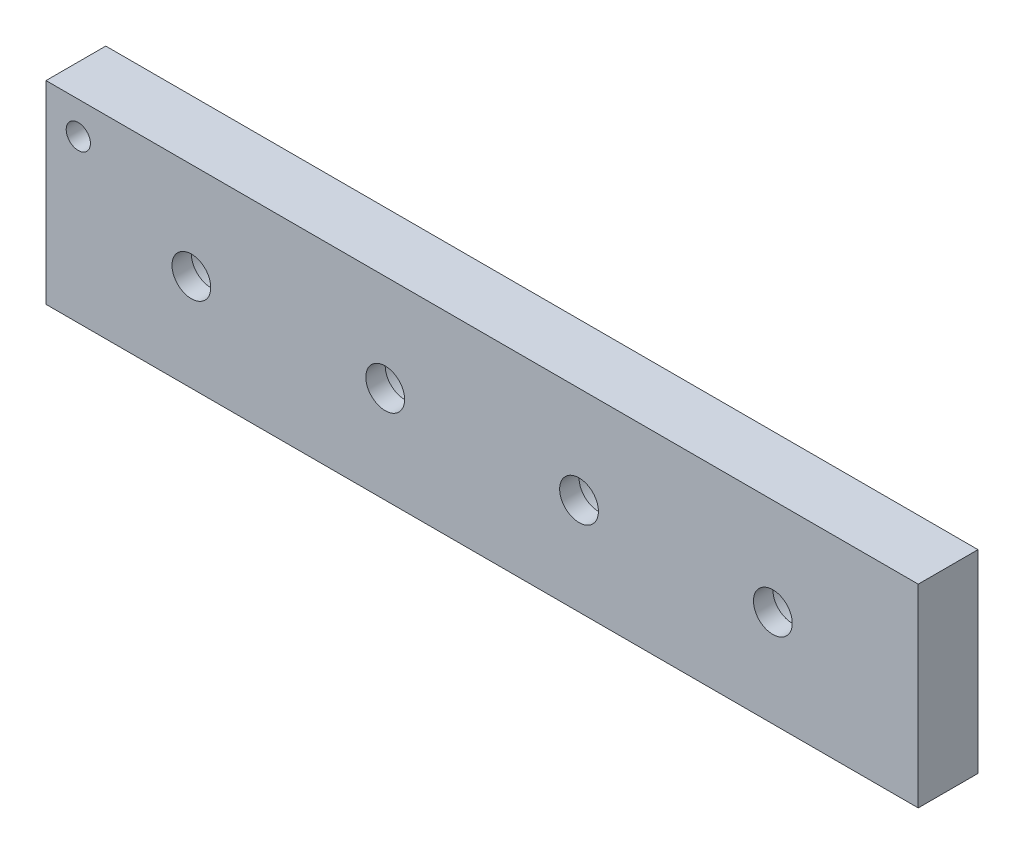
ISO-10303-21;
HEADER;
FILE_DESCRIPTION(('STEP AP214'),'2;1');
FILE_NAME('part.step','',(''),(''),'','','');
FILE_SCHEMA(('AUTOMOTIVE_DESIGN { 1 0 10303 214 1 1 1 1 }'));
ENDSEC;
DATA;
#1=APPLICATION_CONTEXT('core data for automotive mechanical design processes');
#2=APPLICATION_PROTOCOL_DEFINITION('international standard','automotive_design',2000,#1);
#3=PRODUCT_CONTEXT('',#1,'mechanical');
#4=PRODUCT('Part','Part','',(#3));
#5=PRODUCT_RELATED_PRODUCT_CATEGORY('part','',(#4));
#6=PRODUCT_DEFINITION_FORMATION('','',#4);
#7=PRODUCT_DEFINITION_CONTEXT('part definition',#1,'design');
#8=PRODUCT_DEFINITION('design','',#6,#7);
#9=PRODUCT_DEFINITION_SHAPE('','',#8);
#10=(LENGTH_UNIT() NAMED_UNIT(*) SI_UNIT(.MILLI.,.METRE.));
#11=(NAMED_UNIT(*) PLANE_ANGLE_UNIT() SI_UNIT($,.RADIAN.));
#12=(NAMED_UNIT(*) SI_UNIT($,.STERADIAN.) SOLID_ANGLE_UNIT());
#13=UNCERTAINTY_MEASURE_WITH_UNIT(LENGTH_MEASURE(1.E-05),#10,'distance_accuracy_value','');
#14=(GEOMETRIC_REPRESENTATION_CONTEXT(3) GLOBAL_UNCERTAINTY_ASSIGNED_CONTEXT((#13)) GLOBAL_UNIT_ASSIGNED_CONTEXT((#10,
#11,#12)) REPRESENTATION_CONTEXT('',''));
#15=CARTESIAN_POINT('',(0.,0.,0.));
#16=DIRECTION('',(0.,0.,1.));
#17=DIRECTION('',(1.,0.,0.));
#18=AXIS2_PLACEMENT_3D('',#15,#16,#17);
#19=CARTESIAN_POINT('',(-27.,-6.,3.7));
#20=DIRECTION('',(1.,0.,0.));
#21=DIRECTION('',(0.,0.,-1.));
#22=AXIS2_PLACEMENT_3D('',#19,#20,#21);
#23=PLANE('',#22);
#24=DIRECTION('',(0.,-1.,0.));
#25=VECTOR('',#24,1.);
#26=CARTESIAN_POINT('',(-27.,-6.,0.));
#27=LINE('',#26,#25);
#28=CARTESIAN_POINT('',(-27.,6.,0.));
#29=VERTEX_POINT('',#28);
#30=CARTESIAN_POINT('',(-27.,-6.,0.));
#31=VERTEX_POINT('',#30);
#32=EDGE_CURVE('E117',#29,#31,#27,.T.);
#33=ORIENTED_EDGE('',*,*,#32,.T.);
#34=DIRECTION('',(0.,0.,-1.));
#35=VECTOR('',#34,1.);
#36=CARTESIAN_POINT('',(-27.,-6.,3.7));
#37=LINE('',#36,#35);
#38=CARTESIAN_POINT('',(-27.,-6.,3.7));
#39=VERTEX_POINT('',#38);
#40=EDGE_CURVE('E11',#39,#31,#37,.T.);
#41=ORIENTED_EDGE('',*,*,#40,.F.);
#42=DIRECTION('',(0.,-1.,0.));
#43=VECTOR('',#42,1.);
#44=CARTESIAN_POINT('',(-27.,-6.,3.7));
#45=LINE('',#44,#43);
#46=CARTESIAN_POINT('',(-27.,6.,3.7));
#47=VERTEX_POINT('',#46);
#48=EDGE_CURVE('E97',#47,#39,#45,.T.);
#49=ORIENTED_EDGE('',*,*,#48,.F.);
#50=DIRECTION('',(0.,0.,-1.));
#51=VECTOR('',#50,1.);
#52=CARTESIAN_POINT('',(-27.,6.,3.7));
#53=LINE('',#52,#51);
#54=EDGE_CURVE('E115',#47,#29,#53,.T.);
#55=ORIENTED_EDGE('',*,*,#54,.T.);
#56=EDGE_LOOP('',(#33,#41,#49,#55));
#57=FACE_BOUND('',#56,.T.);
#58=ADVANCED_FACE('F44',(#57),#23,.F.);
#59=CARTESIAN_POINT('',(-27.,-6.,3.7));
#60=DIRECTION('',(0.,1.,0.));
#61=DIRECTION('',(0.,0.,1.));
#62=AXIS2_PLACEMENT_3D('',#59,#60,#61);
#63=PLANE('',#62);
#64=DIRECTION('',(1.,0.,0.));
#65=VECTOR('',#64,1.);
#66=CARTESIAN_POINT('',(-27.,-6.,0.));
#67=LINE('',#66,#65);
#68=CARTESIAN_POINT('',(27.,-6.,0.));
#69=VERTEX_POINT('',#68);
#70=EDGE_CURVE('E102',#31,#69,#67,.T.);
#71=ORIENTED_EDGE('',*,*,#70,.T.);
#72=DIRECTION('',(0.,0.,-1.));
#73=VECTOR('',#72,1.);
#74=CARTESIAN_POINT('',(27.,-6.,3.7));
#75=LINE('',#74,#73);
#76=CARTESIAN_POINT('',(27.,-6.,3.7));
#77=VERTEX_POINT('',#76);
#78=EDGE_CURVE('E54',#77,#69,#75,.T.);
#79=ORIENTED_EDGE('',*,*,#78,.F.);
#80=DIRECTION('',(1.,0.,0.));
#81=VECTOR('',#80,1.);
#82=CARTESIAN_POINT('',(-27.,-6.,3.7));
#83=LINE('',#82,#81);
#84=EDGE_CURVE('E94',#39,#77,#83,.T.);
#85=ORIENTED_EDGE('',*,*,#84,.F.);
#86=ORIENTED_EDGE('',*,*,#40,.T.);
#87=EDGE_LOOP('',(#71,#79,#85,#86));
#88=FACE_BOUND('',#87,.T.);
#89=ADVANCED_FACE('F103',(#88),#63,.F.);
#90=CARTESIAN_POINT('',(27.,-6.,3.7));
#91=DIRECTION('',(-1.,0.,0.));
#92=DIRECTION('',(0.,0.,1.));
#93=AXIS2_PLACEMENT_3D('',#90,#91,#92);
#94=PLANE('',#93);
#95=DIRECTION('',(0.,1.,0.));
#96=VECTOR('',#95,1.);
#97=CARTESIAN_POINT('',(27.,-6.,0.));
#98=LINE('',#97,#96);
#99=CARTESIAN_POINT('',(27.,6.,0.));
#100=VERTEX_POINT('',#99);
#101=EDGE_CURVE('E83',#69,#100,#98,.T.);
#102=ORIENTED_EDGE('',*,*,#101,.T.);
#103=DIRECTION('',(0.,0.,-1.));
#104=VECTOR('',#103,1.);
#105=CARTESIAN_POINT('',(27.,6.,3.7));
#106=LINE('',#105,#104);
#107=CARTESIAN_POINT('',(27.,6.,3.7));
#108=VERTEX_POINT('',#107);
#109=EDGE_CURVE('E106',#108,#100,#106,.T.);
#110=ORIENTED_EDGE('',*,*,#109,.F.);
#111=DIRECTION('',(0.,1.,0.));
#112=VECTOR('',#111,1.);
#113=CARTESIAN_POINT('',(27.,-6.,3.7));
#114=LINE('',#113,#112);
#115=EDGE_CURVE('E100',#77,#108,#114,.T.);
#116=ORIENTED_EDGE('',*,*,#115,.F.);
#117=ORIENTED_EDGE('',*,*,#78,.T.);
#118=EDGE_LOOP('',(#102,#110,#116,#117));
#119=FACE_BOUND('',#118,.T.);
#120=ADVANCED_FACE('F107',(#119),#94,.F.);
#121=CARTESIAN_POINT('',(-27.,6.,3.7));
#122=DIRECTION('',(0.,-1.,0.));
#123=DIRECTION('',(0.,0.,-1.));
#124=AXIS2_PLACEMENT_3D('',#121,#122,#123);
#125=PLANE('',#124);
#126=DIRECTION('',(-1.,0.,0.));
#127=VECTOR('',#126,1.);
#128=CARTESIAN_POINT('',(-27.,6.,0.));
#129=LINE('',#128,#127);
#130=EDGE_CURVE('E87',#100,#29,#129,.T.);
#131=ORIENTED_EDGE('',*,*,#130,.T.);
#132=ORIENTED_EDGE('',*,*,#54,.F.);
#133=DIRECTION('',(-1.,0.,0.));
#134=VECTOR('',#133,1.);
#135=CARTESIAN_POINT('',(-27.,6.,3.7));
#136=LINE('',#135,#134);
#137=EDGE_CURVE('E61',#108,#47,#136,.T.);
#138=ORIENTED_EDGE('',*,*,#137,.F.);
#139=ORIENTED_EDGE('',*,*,#109,.T.);
#140=EDGE_LOOP('',(#131,#132,#138,#139));
#141=FACE_BOUND('',#140,.T.);
#142=ADVANCED_FACE('F239',(#141),#125,.F.);
#143=CARTESIAN_POINT('',(0.,0.,3.7));
#144=DIRECTION('',(0.,0.,-1.));
#145=DIRECTION('',(-1.,0.,0.));
#146=AXIS2_PLACEMENT_3D('',#143,#144,#145);
#147=PLANE('',#146);
#148=CARTESIAN_POINT('',(-25.,4.,3.7));
#149=DIRECTION('',(0.,0.,1.));
#150=DIRECTION('',(1.,0.,0.));
#151=AXIS2_PLACEMENT_3D('',#148,#149,#150);
#152=CIRCLE('',#151,0.750000000000001);
#153=CARTESIAN_POINT('',(-25.75,4.,3.7));
#154=VERTEX_POINT('',#153);
#155=EDGE_CURVE('E199',#154,#154,#152,.T.);
#156=ORIENTED_EDGE('',*,*,#155,.F.);
#157=EDGE_LOOP('',(#156));
#158=FACE_BOUND('',#157,.T.);
#159=CARTESIAN_POINT('',(-18.,0.,3.7));
#160=DIRECTION('',(0.,0.,1.));
#161=DIRECTION('',(1.,0.,0.));
#162=AXIS2_PLACEMENT_3D('',#159,#160,#161);
#163=CIRCLE('',#162,1.2);
#164=CARTESIAN_POINT('',(-19.2,0.,3.7));
#165=VERTEX_POINT('',#164);
#166=EDGE_CURVE('E138',#165,#165,#163,.T.);
#167=ORIENTED_EDGE('',*,*,#166,.F.);
#168=EDGE_LOOP('',(#167));
#169=FACE_BOUND('',#168,.T.);
#170=CARTESIAN_POINT('',(-6.,0.,3.7));
#171=DIRECTION('',(0.,0.,1.));
#172=DIRECTION('',(1.,0.,0.));
#173=AXIS2_PLACEMENT_3D('',#170,#171,#172);
#174=CIRCLE('',#173,1.2);
#175=CARTESIAN_POINT('',(-7.2,0.,3.7));
#176=VERTEX_POINT('',#175);
#177=EDGE_CURVE('E191',#176,#176,#174,.T.);
#178=ORIENTED_EDGE('',*,*,#177,.F.);
#179=EDGE_LOOP('',(#178));
#180=FACE_BOUND('',#179,.T.);
#181=CARTESIAN_POINT('',(6.,0.,3.7));
#182=DIRECTION('',(0.,0.,1.));
#183=DIRECTION('',(1.,0.,0.));
#184=AXIS2_PLACEMENT_3D('',#181,#182,#183);
#185=CIRCLE('',#184,1.2);
#186=CARTESIAN_POINT('',(4.8,0.,3.7));
#187=VERTEX_POINT('',#186);
#188=EDGE_CURVE('E186',#187,#187,#185,.T.);
#189=ORIENTED_EDGE('',*,*,#188,.F.);
#190=EDGE_LOOP('',(#189));
#191=FACE_BOUND('',#190,.T.);
#192=CARTESIAN_POINT('',(18.,0.,3.7));
#193=DIRECTION('',(0.,0.,1.));
#194=DIRECTION('',(1.,0.,0.));
#195=AXIS2_PLACEMENT_3D('',#192,#193,#194);
#196=CIRCLE('',#195,1.2);
#197=CARTESIAN_POINT('',(16.8,0.,3.7));
#198=VERTEX_POINT('',#197);
#199=EDGE_CURVE('E183',#198,#198,#196,.T.);
#200=ORIENTED_EDGE('',*,*,#199,.F.);
#201=EDGE_LOOP('',(#200));
#202=FACE_BOUND('',#201,.T.);
#203=ORIENTED_EDGE('',*,*,#48,.T.);
#204=ORIENTED_EDGE('',*,*,#84,.T.);
#205=ORIENTED_EDGE('',*,*,#115,.T.);
#206=ORIENTED_EDGE('',*,*,#137,.T.);
#207=EDGE_LOOP('',(#203,#204,#205,#206));
#208=FACE_BOUND('',#207,.T.);
#209=ADVANCED_FACE('F92',(#158,#169,#180,#191,#202,#208),#147,.F.);
#210=CARTESIAN_POINT('',(0.,0.,0.));
#211=DIRECTION('',(0.,0.,-1.));
#212=DIRECTION('',(-1.,0.,0.));
#213=AXIS2_PLACEMENT_3D('',#210,#211,#212);
#214=PLANE('',#213);
#215=CARTESIAN_POINT('',(-25.,4.,0.));
#216=DIRECTION('',(0.,0.,-1.));
#217=DIRECTION('',(-1.,0.,0.));
#218=AXIS2_PLACEMENT_3D('',#215,#216,#217);
#219=CIRCLE('',#218,0.750000000000001);
#220=CARTESIAN_POINT('',(-25.75,4.,0.));
#221=VERTEX_POINT('',#220);
#222=EDGE_CURVE('E48',#221,#221,#219,.F.);
#223=ORIENTED_EDGE('',*,*,#222,.T.);
#224=EDGE_LOOP('',(#223));
#225=FACE_BOUND('',#224,.T.);
#226=CARTESIAN_POINT('',(-18.,0.,0.));
#227=DIRECTION('',(0.,0.,1.));
#228=DIRECTION('',(1.,0.,0.));
#229=AXIS2_PLACEMENT_3D('',#226,#227,#228);
#230=CIRCLE('',#229,2.325);
#231=CARTESIAN_POINT('',(-15.675,0.,0.));
#232=VERTEX_POINT('',#231);
#233=EDGE_CURVE('E163',#232,#232,#230,.T.);
#234=ORIENTED_EDGE('',*,*,#233,.T.);
#235=EDGE_LOOP('',(#234));
#236=FACE_BOUND('',#235,.T.);
#237=CARTESIAN_POINT('',(-6.,0.,0.));
#238=DIRECTION('',(0.,0.,1.));
#239=DIRECTION('',(1.,0.,0.));
#240=AXIS2_PLACEMENT_3D('',#237,#238,#239);
#241=CIRCLE('',#240,2.375);
#242=CARTESIAN_POINT('',(-3.625,0.,0.));
#243=VERTEX_POINT('',#242);
#244=EDGE_CURVE('E169',#243,#243,#241,.T.);
#245=ORIENTED_EDGE('',*,*,#244,.T.);
#246=EDGE_LOOP('',(#245));
#247=FACE_BOUND('',#246,.T.);
#248=CARTESIAN_POINT('',(6.,0.,0.));
#249=DIRECTION('',(0.,0.,1.));
#250=DIRECTION('',(1.,0.,0.));
#251=AXIS2_PLACEMENT_3D('',#248,#249,#250);
#252=CIRCLE('',#251,2.425);
#253=CARTESIAN_POINT('',(8.425,0.,0.));
#254=VERTEX_POINT('',#253);
#255=EDGE_CURVE('E178',#254,#254,#252,.T.);
#256=ORIENTED_EDGE('',*,*,#255,.T.);
#257=EDGE_LOOP('',(#256));
#258=FACE_BOUND('',#257,.T.);
#259=CARTESIAN_POINT('',(18.,0.,0.));
#260=DIRECTION('',(0.,0.,1.));
#261=DIRECTION('',(1.,0.,0.));
#262=AXIS2_PLACEMENT_3D('',#259,#260,#261);
#263=CIRCLE('',#262,2.475);
#264=CARTESIAN_POINT('',(20.475,0.,0.));
#265=VERTEX_POINT('',#264);
#266=EDGE_CURVE('E151',#265,#265,#263,.T.);
#267=ORIENTED_EDGE('',*,*,#266,.T.);
#268=EDGE_LOOP('',(#267));
#269=FACE_BOUND('',#268,.T.);
#270=ORIENTED_EDGE('',*,*,#32,.F.);
#271=ORIENTED_EDGE('',*,*,#130,.F.);
#272=ORIENTED_EDGE('',*,*,#101,.F.);
#273=ORIENTED_EDGE('',*,*,#70,.F.);
#274=EDGE_LOOP('',(#270,#271,#272,#273));
#275=FACE_BOUND('',#274,.T.);
#276=ADVANCED_FACE('F207',(#225,#236,#247,#258,#269,#275),#214,.T.);
#277=CARTESIAN_POINT('',(18.,0.,2.5));
#278=DIRECTION('',(0.,0.,-1.));
#279=DIRECTION('',(-1.,0.,0.));
#280=AXIS2_PLACEMENT_3D('',#277,#278,#279);
#281=CYLINDRICAL_SURFACE('',#280,2.475);
#282=CARTESIAN_POINT('',(18.,0.,2.5));
#283=DIRECTION('',(0.,0.,1.));
#284=DIRECTION('',(1.,0.,0.));
#285=AXIS2_PLACEMENT_3D('',#282,#283,#284);
#286=CIRCLE('',#285,2.475);
#287=CARTESIAN_POINT('',(20.475,0.,2.5));
#288=VERTEX_POINT('',#287);
#289=EDGE_CURVE('E148',#288,#288,#286,.T.);
#290=ORIENTED_EDGE('',*,*,#289,.T.);
#291=EDGE_LOOP('',(#290));
#292=FACE_BOUND('',#291,.T.);
#293=ORIENTED_EDGE('',*,*,#266,.F.);
#294=EDGE_LOOP('',(#293));
#295=FACE_BOUND('',#294,.T.);
#296=ADVANCED_FACE('F233',(#292,#295),#281,.F.);
#297=CARTESIAN_POINT('',(18.,0.,2.5));
#298=DIRECTION('',(0.,0.,1.));
#299=DIRECTION('',(1.,0.,0.));
#300=AXIS2_PLACEMENT_3D('',#297,#298,#299);
#301=PLANE('',#300);
#302=CARTESIAN_POINT('',(18.,0.,2.5));
#303=DIRECTION('',(0.,0.,1.));
#304=DIRECTION('',(1.,0.,0.));
#305=AXIS2_PLACEMENT_3D('',#302,#303,#304);
#306=CIRCLE('',#305,1.2);
#307=CARTESIAN_POINT('',(16.8,0.,2.5));
#308=VERTEX_POINT('',#307);
#309=EDGE_CURVE('E141',#308,#308,#306,.F.);
#310=ORIENTED_EDGE('',*,*,#309,.F.);
#311=EDGE_LOOP('',(#310));
#312=FACE_BOUND('',#311,.T.);
#313=ORIENTED_EDGE('',*,*,#289,.F.);
#314=EDGE_LOOP('',(#313));
#315=FACE_BOUND('',#314,.T.);
#316=ADVANCED_FACE('F240',(#312,#315),#301,.F.);
#317=CARTESIAN_POINT('',(6.,0.,2.5));
#318=DIRECTION('',(0.,0.,-1.));
#319=DIRECTION('',(-1.,0.,0.));
#320=AXIS2_PLACEMENT_3D('',#317,#318,#319);
#321=CYLINDRICAL_SURFACE('',#320,2.425);
#322=CARTESIAN_POINT('',(6.,0.,2.5));
#323=DIRECTION('',(0.,0.,1.));
#324=DIRECTION('',(1.,0.,0.));
#325=AXIS2_PLACEMENT_3D('',#322,#323,#324);
#326=CIRCLE('',#325,2.425);
#327=CARTESIAN_POINT('',(8.425,0.,2.5));
#328=VERTEX_POINT('',#327);
#329=EDGE_CURVE('E160',#328,#328,#326,.T.);
#330=ORIENTED_EDGE('',*,*,#329,.T.);
#331=EDGE_LOOP('',(#330));
#332=FACE_BOUND('',#331,.T.);
#333=ORIENTED_EDGE('',*,*,#255,.F.);
#334=EDGE_LOOP('',(#333));
#335=FACE_BOUND('',#334,.T.);
#336=ADVANCED_FACE('F270',(#332,#335),#321,.F.);
#337=CARTESIAN_POINT('',(6.,0.,2.5));
#338=DIRECTION('',(0.,0.,1.));
#339=DIRECTION('',(1.,0.,0.));
#340=AXIS2_PLACEMENT_3D('',#337,#338,#339);
#341=PLANE('',#340);
#342=CARTESIAN_POINT('',(6.,0.,2.5));
#343=DIRECTION('',(0.,0.,1.));
#344=DIRECTION('',(1.,0.,0.));
#345=AXIS2_PLACEMENT_3D('',#342,#343,#344);
#346=CIRCLE('',#345,1.2);
#347=CARTESIAN_POINT('',(4.8,0.,2.5));
#348=VERTEX_POINT('',#347);
#349=EDGE_CURVE('E137',#348,#348,#346,.F.);
#350=ORIENTED_EDGE('',*,*,#349,.F.);
#351=EDGE_LOOP('',(#350));
#352=FACE_BOUND('',#351,.T.);
#353=ORIENTED_EDGE('',*,*,#329,.F.);
#354=EDGE_LOOP('',(#353));
#355=FACE_BOUND('',#354,.T.);
#356=ADVANCED_FACE('F271',(#352,#355),#341,.F.);
#357=CARTESIAN_POINT('',(-6.,0.,2.5));
#358=DIRECTION('',(0.,0.,-1.));
#359=DIRECTION('',(-1.,0.,0.));
#360=AXIS2_PLACEMENT_3D('',#357,#358,#359);
#361=CYLINDRICAL_SURFACE('',#360,2.375);
#362=CARTESIAN_POINT('',(-6.,0.,2.5));
#363=DIRECTION('',(0.,0.,1.));
#364=DIRECTION('',(1.,0.,0.));
#365=AXIS2_PLACEMENT_3D('',#362,#363,#364);
#366=CIRCLE('',#365,2.375);
#367=CARTESIAN_POINT('',(-3.625,0.,2.5));
#368=VERTEX_POINT('',#367);
#369=EDGE_CURVE('E175',#368,#368,#366,.T.);
#370=ORIENTED_EDGE('',*,*,#369,.T.);
#371=EDGE_LOOP('',(#370));
#372=FACE_BOUND('',#371,.T.);
#373=ORIENTED_EDGE('',*,*,#244,.F.);
#374=EDGE_LOOP('',(#373));
#375=FACE_BOUND('',#374,.T.);
#376=ADVANCED_FACE('F280',(#372,#375),#361,.F.);
#377=CARTESIAN_POINT('',(-6.,0.,2.5));
#378=DIRECTION('',(0.,0.,1.));
#379=DIRECTION('',(1.,0.,0.));
#380=AXIS2_PLACEMENT_3D('',#377,#378,#379);
#381=PLANE('',#380);
#382=CARTESIAN_POINT('',(-6.,0.,2.5));
#383=DIRECTION('',(0.,0.,1.));
#384=DIRECTION('',(1.,0.,0.));
#385=AXIS2_PLACEMENT_3D('',#382,#383,#384);
#386=CIRCLE('',#385,1.2);
#387=CARTESIAN_POINT('',(-7.2,0.,2.5));
#388=VERTEX_POINT('',#387);
#389=EDGE_CURVE('E133',#388,#388,#386,.F.);
#390=ORIENTED_EDGE('',*,*,#389,.F.);
#391=EDGE_LOOP('',(#390));
#392=FACE_BOUND('',#391,.T.);
#393=ORIENTED_EDGE('',*,*,#369,.F.);
#394=EDGE_LOOP('',(#393));
#395=FACE_BOUND('',#394,.T.);
#396=ADVANCED_FACE('F282',(#392,#395),#381,.F.);
#397=CARTESIAN_POINT('',(-18.,0.,2.5));
#398=DIRECTION('',(0.,0.,-1.));
#399=DIRECTION('',(-1.,0.,0.));
#400=AXIS2_PLACEMENT_3D('',#397,#398,#399);
#401=CYLINDRICAL_SURFACE('',#400,2.325);
#402=CARTESIAN_POINT('',(-18.,0.,2.5));
#403=DIRECTION('',(0.,0.,1.));
#404=DIRECTION('',(1.,0.,0.));
#405=AXIS2_PLACEMENT_3D('',#402,#403,#404);
#406=CIRCLE('',#405,2.325);
#407=CARTESIAN_POINT('',(-15.675,0.,2.5));
#408=VERTEX_POINT('',#407);
#409=EDGE_CURVE('E118',#408,#408,#406,.T.);
#410=ORIENTED_EDGE('',*,*,#409,.T.);
#411=EDGE_LOOP('',(#410));
#412=FACE_BOUND('',#411,.T.);
#413=ORIENTED_EDGE('',*,*,#233,.F.);
#414=EDGE_LOOP('',(#413));
#415=FACE_BOUND('',#414,.T.);
#416=ADVANCED_FACE('F286',(#412,#415),#401,.F.);
#417=CARTESIAN_POINT('',(-18.,0.,2.5));
#418=DIRECTION('',(0.,0.,1.));
#419=DIRECTION('',(1.,0.,0.));
#420=AXIS2_PLACEMENT_3D('',#417,#418,#419);
#421=PLANE('',#420);
#422=CARTESIAN_POINT('',(-18.,0.,2.5));
#423=DIRECTION('',(0.,0.,1.));
#424=DIRECTION('',(1.,0.,0.));
#425=AXIS2_PLACEMENT_3D('',#422,#423,#424);
#426=CIRCLE('',#425,1.2);
#427=CARTESIAN_POINT('',(-19.2,0.,2.5));
#428=VERTEX_POINT('',#427);
#429=EDGE_CURVE('E132',#428,#428,#426,.F.);
#430=ORIENTED_EDGE('',*,*,#429,.F.);
#431=EDGE_LOOP('',(#430));
#432=FACE_BOUND('',#431,.T.);
#433=ORIENTED_EDGE('',*,*,#409,.F.);
#434=EDGE_LOOP('',(#433));
#435=FACE_BOUND('',#434,.T.);
#436=ADVANCED_FACE('F295',(#432,#435),#421,.F.);
#437=CARTESIAN_POINT('',(-18.,0.,3.7));
#438=DIRECTION('',(0.,0.,-1.));
#439=DIRECTION('',(-1.,0.,0.));
#440=AXIS2_PLACEMENT_3D('',#437,#438,#439);
#441=CYLINDRICAL_SURFACE('',#440,1.2);
#442=CARTESIAN_POINT('',(-19.2,0.,3.7));
#443=CARTESIAN_POINT('',(-19.2,0.,3.6875));
#444=CARTESIAN_POINT('',(-19.2,0.,3.675));
#445=CARTESIAN_POINT('',(-19.2,0.,3.65));
#446=CARTESIAN_POINT('',(-19.2,0.,3.6375));
#447=CARTESIAN_POINT('',(-19.2,0.,3.6125));
#448=CARTESIAN_POINT('',(-19.2,0.,3.6));
#449=CARTESIAN_POINT('',(-19.2,0.,3.575));
#450=CARTESIAN_POINT('',(-19.2,0.,3.5625));
#451=CARTESIAN_POINT('',(-19.2,0.,3.5375));
#452=CARTESIAN_POINT('',(-19.2,0.,3.525));
#453=CARTESIAN_POINT('',(-19.2,0.,3.5));
#454=CARTESIAN_POINT('',(-19.2,0.,3.4875));
#455=CARTESIAN_POINT('',(-19.2,0.,3.4625));
#456=CARTESIAN_POINT('',(-19.2,0.,3.45));
#457=CARTESIAN_POINT('',(-19.2,0.,3.425));
#458=CARTESIAN_POINT('',(-19.2,0.,3.4125));
#459=CARTESIAN_POINT('',(-19.2,0.,3.3875));
#460=CARTESIAN_POINT('',(-19.2,0.,3.375));
#461=CARTESIAN_POINT('',(-19.2,0.,3.35));
#462=CARTESIAN_POINT('',(-19.2,0.,3.3375));
#463=CARTESIAN_POINT('',(-19.2,0.,3.3125));
#464=CARTESIAN_POINT('',(-19.2,0.,3.3));
#465=CARTESIAN_POINT('',(-19.2,0.,3.275));
#466=CARTESIAN_POINT('',(-19.2,0.,3.2625));
#467=CARTESIAN_POINT('',(-19.2,0.,3.2375));
#468=CARTESIAN_POINT('',(-19.2,0.,3.225));
#469=CARTESIAN_POINT('',(-19.2,0.,3.2));
#470=CARTESIAN_POINT('',(-19.2,0.,3.1875));
#471=CARTESIAN_POINT('',(-19.2,0.,3.1625));
#472=CARTESIAN_POINT('',(-19.2,0.,3.15));
#473=CARTESIAN_POINT('',(-19.2,0.,3.125));
#474=CARTESIAN_POINT('',(-19.2,0.,3.1125));
#475=CARTESIAN_POINT('',(-19.2,0.,3.0875));
#476=CARTESIAN_POINT('',(-19.2,0.,3.075));
#477=CARTESIAN_POINT('',(-19.2,0.,3.05));
#478=CARTESIAN_POINT('',(-19.2,0.,3.0375));
#479=CARTESIAN_POINT('',(-19.2,0.,3.0125));
#480=CARTESIAN_POINT('',(-19.2,0.,3.));
#481=CARTESIAN_POINT('',(-19.2,0.,2.975));
#482=CARTESIAN_POINT('',(-19.2,0.,2.9625));
#483=CARTESIAN_POINT('',(-19.2,0.,2.9375));
#484=CARTESIAN_POINT('',(-19.2,0.,2.925));
#485=CARTESIAN_POINT('',(-19.2,0.,2.9));
#486=CARTESIAN_POINT('',(-19.2,0.,2.8875));
#487=CARTESIAN_POINT('',(-19.2,0.,2.8625));
#488=CARTESIAN_POINT('',(-19.2,0.,2.85));
#489=CARTESIAN_POINT('',(-19.2,0.,2.825));
#490=CARTESIAN_POINT('',(-19.2,0.,2.8125));
#491=CARTESIAN_POINT('',(-19.2,0.,2.7875));
#492=CARTESIAN_POINT('',(-19.2,0.,2.775));
#493=CARTESIAN_POINT('',(-19.2,0.,2.75));
#494=CARTESIAN_POINT('',(-19.2,0.,2.7375));
#495=CARTESIAN_POINT('',(-19.2,0.,2.7125));
#496=CARTESIAN_POINT('',(-19.2,0.,2.7));
#497=CARTESIAN_POINT('',(-19.2,0.,2.675));
#498=CARTESIAN_POINT('',(-19.2,0.,2.6625));
#499=CARTESIAN_POINT('',(-19.2,0.,2.6375));
#500=CARTESIAN_POINT('',(-19.2,0.,2.625));
#501=CARTESIAN_POINT('',(-19.2,0.,2.6));
#502=CARTESIAN_POINT('',(-19.2,0.,2.5875));
#503=CARTESIAN_POINT('',(-19.2,0.,2.5625));
#504=CARTESIAN_POINT('',(-19.2,0.,2.55));
#505=CARTESIAN_POINT('',(-19.2,0.,2.525));
#506=CARTESIAN_POINT('',(-19.2,0.,2.5125));
#507=CARTESIAN_POINT('',(-19.2,0.,2.5));
#508=B_SPLINE_CURVE_WITH_KNOTS('',3,(#442,#443,#444,#445,#446,#447,#448,#449,#450,#451,#452,
#453,#454,#455,#456,#457,#458,#459,#460,#461,#462,#463,#464,#465,#466,#467,#468,#469,#470,#471,
#472,#473,#474,#475,#476,#477,#478,#479,#480,#481,#482,#483,#484,#485,#486,#487,#488,#489,#490,
#491,#492,#493,#494,#495,#496,#497,#498,#499,#500,#501,#502,#503,#504,#505,#506,#507),
.UNSPECIFIED.,.F.,.F.,(4,2,2,2,2,2,2,2,2,2,2,2,2,2,2,2,2,2,2,2,2,2,2,2,2,2,2,2,2,2,2,2,4),(0.,
0.0375000000000002,0.0750000000000004,0.1125,0.15,0.187500000000001,0.225,0.262500000000001,
0.300000000000001,0.337500000000001,0.375000000000001,0.412500000000001,0.450000000000001,
0.487500000000001,0.525000000000001,0.562500000000001,0.600000000000001,0.637500000000001,
0.675000000000001,0.712500000000001,0.750000000000002,0.787500000000001,0.825000000000002,
0.862500000000002,0.900000000000001,0.937500000000002,0.975000000000002,1.0125,1.05,1.0875,
1.125,1.1625,1.2),.UNSPECIFIED.);
#509=EDGE_CURVE('BSEAM321',#165,#428,#508,.T.);
#510=ORIENTED_EDGE('',*,*,#166,.T.);
#511=ORIENTED_EDGE('',*,*,#429,.T.);
#512=ORIENTED_EDGE('',*,*,#509,.T.);
#513=ORIENTED_EDGE('',*,*,#509,.F.);
#514=EDGE_LOOP('',(#510,#512,#511,#513));
#515=FACE_BOUND('',#514,.T.);
#516=ADVANCED_FACE('F321',(#515),#441,.F.);
#517=CARTESIAN_POINT('',(-6.,0.,3.7));
#518=DIRECTION('',(0.,0.,-1.));
#519=DIRECTION('',(-1.,0.,0.));
#520=AXIS2_PLACEMENT_3D('',#517,#518,#519);
#521=CYLINDRICAL_SURFACE('',#520,1.2);
#522=CARTESIAN_POINT('',(-7.2,0.,3.7));
#523=CARTESIAN_POINT('',(-7.2,0.,3.6875));
#524=CARTESIAN_POINT('',(-7.2,0.,3.675));
#525=CARTESIAN_POINT('',(-7.2,0.,3.65));
#526=CARTESIAN_POINT('',(-7.2,0.,3.6375));
#527=CARTESIAN_POINT('',(-7.2,0.,3.6125));
#528=CARTESIAN_POINT('',(-7.2,0.,3.6));
#529=CARTESIAN_POINT('',(-7.2,0.,3.575));
#530=CARTESIAN_POINT('',(-7.2,0.,3.5625));
#531=CARTESIAN_POINT('',(-7.2,0.,3.5375));
#532=CARTESIAN_POINT('',(-7.2,0.,3.525));
#533=CARTESIAN_POINT('',(-7.2,0.,3.5));
#534=CARTESIAN_POINT('',(-7.2,0.,3.4875));
#535=CARTESIAN_POINT('',(-7.2,0.,3.4625));
#536=CARTESIAN_POINT('',(-7.2,0.,3.45));
#537=CARTESIAN_POINT('',(-7.2,0.,3.425));
#538=CARTESIAN_POINT('',(-7.2,0.,3.4125));
#539=CARTESIAN_POINT('',(-7.2,0.,3.3875));
#540=CARTESIAN_POINT('',(-7.2,0.,3.375));
#541=CARTESIAN_POINT('',(-7.2,0.,3.35));
#542=CARTESIAN_POINT('',(-7.2,0.,3.3375));
#543=CARTESIAN_POINT('',(-7.2,0.,3.3125));
#544=CARTESIAN_POINT('',(-7.2,0.,3.3));
#545=CARTESIAN_POINT('',(-7.2,0.,3.275));
#546=CARTESIAN_POINT('',(-7.2,0.,3.2625));
#547=CARTESIAN_POINT('',(-7.2,0.,3.2375));
#548=CARTESIAN_POINT('',(-7.2,0.,3.225));
#549=CARTESIAN_POINT('',(-7.2,0.,3.2));
#550=CARTESIAN_POINT('',(-7.2,0.,3.1875));
#551=CARTESIAN_POINT('',(-7.2,0.,3.1625));
#552=CARTESIAN_POINT('',(-7.2,0.,3.15));
#553=CARTESIAN_POINT('',(-7.2,0.,3.125));
#554=CARTESIAN_POINT('',(-7.2,0.,3.1125));
#555=CARTESIAN_POINT('',(-7.2,0.,3.0875));
#556=CARTESIAN_POINT('',(-7.2,0.,3.075));
#557=CARTESIAN_POINT('',(-7.2,0.,3.05));
#558=CARTESIAN_POINT('',(-7.2,0.,3.0375));
#559=CARTESIAN_POINT('',(-7.2,0.,3.0125));
#560=CARTESIAN_POINT('',(-7.2,0.,3.));
#561=CARTESIAN_POINT('',(-7.2,0.,2.975));
#562=CARTESIAN_POINT('',(-7.2,0.,2.9625));
#563=CARTESIAN_POINT('',(-7.2,0.,2.9375));
#564=CARTESIAN_POINT('',(-7.2,0.,2.925));
#565=CARTESIAN_POINT('',(-7.2,0.,2.9));
#566=CARTESIAN_POINT('',(-7.2,0.,2.8875));
#567=CARTESIAN_POINT('',(-7.2,0.,2.8625));
#568=CARTESIAN_POINT('',(-7.2,0.,2.85));
#569=CARTESIAN_POINT('',(-7.2,0.,2.825));
#570=CARTESIAN_POINT('',(-7.2,0.,2.8125));
#571=CARTESIAN_POINT('',(-7.2,0.,2.7875));
#572=CARTESIAN_POINT('',(-7.2,0.,2.775));
#573=CARTESIAN_POINT('',(-7.2,0.,2.75));
#574=CARTESIAN_POINT('',(-7.2,0.,2.7375));
#575=CARTESIAN_POINT('',(-7.2,0.,2.7125));
#576=CARTESIAN_POINT('',(-7.2,0.,2.7));
#577=CARTESIAN_POINT('',(-7.2,0.,2.675));
#578=CARTESIAN_POINT('',(-7.2,0.,2.6625));
#579=CARTESIAN_POINT('',(-7.2,0.,2.6375));
#580=CARTESIAN_POINT('',(-7.2,0.,2.625));
#581=CARTESIAN_POINT('',(-7.2,0.,2.6));
#582=CARTESIAN_POINT('',(-7.2,0.,2.5875));
#583=CARTESIAN_POINT('',(-7.2,0.,2.5625));
#584=CARTESIAN_POINT('',(-7.2,0.,2.55));
#585=CARTESIAN_POINT('',(-7.2,0.,2.525));
#586=CARTESIAN_POINT('',(-7.2,0.,2.5125));
#587=CARTESIAN_POINT('',(-7.2,0.,2.5));
#588=B_SPLINE_CURVE_WITH_KNOTS('',3,(#522,#523,#524,#525,#526,#527,#528,#529,#530,#531,#532,
#533,#534,#535,#536,#537,#538,#539,#540,#541,#542,#543,#544,#545,#546,#547,#548,#549,#550,#551,
#552,#553,#554,#555,#556,#557,#558,#559,#560,#561,#562,#563,#564,#565,#566,#567,#568,#569,#570,
#571,#572,#573,#574,#575,#576,#577,#578,#579,#580,#581,#582,#583,#584,#585,#586,#587),
.UNSPECIFIED.,.F.,.F.,(4,2,2,2,2,2,2,2,2,2,2,2,2,2,2,2,2,2,2,2,2,2,2,2,2,2,2,2,2,2,2,2,4),(0.,
0.0375000000000002,0.0750000000000004,0.1125,0.15,0.187500000000001,0.225,0.262500000000001,
0.300000000000001,0.337500000000001,0.375000000000001,0.412500000000001,0.450000000000001,
0.487500000000001,0.525000000000001,0.562500000000001,0.600000000000001,0.637500000000001,
0.675000000000001,0.712500000000001,0.750000000000002,0.787500000000001,0.825000000000002,
0.862500000000002,0.900000000000001,0.937500000000002,0.975000000000002,1.0125,1.05,1.0875,
1.125,1.1625,1.2),.UNSPECIFIED.);
#589=EDGE_CURVE('BSEAM329',#176,#388,#588,.T.);
#590=ORIENTED_EDGE('',*,*,#177,.T.);
#591=ORIENTED_EDGE('',*,*,#389,.T.);
#592=ORIENTED_EDGE('',*,*,#589,.T.);
#593=ORIENTED_EDGE('',*,*,#589,.F.);
#594=EDGE_LOOP('',(#590,#592,#591,#593));
#595=FACE_BOUND('',#594,.T.);
#596=ADVANCED_FACE('F329',(#595),#521,.F.);
#597=CARTESIAN_POINT('',(6.,0.,3.7));
#598=DIRECTION('',(0.,0.,-1.));
#599=DIRECTION('',(-1.,0.,0.));
#600=AXIS2_PLACEMENT_3D('',#597,#598,#599);
#601=CYLINDRICAL_SURFACE('',#600,1.2);
#602=CARTESIAN_POINT('',(4.8,0.,3.7));
#603=CARTESIAN_POINT('',(4.8,0.,3.6875));
#604=CARTESIAN_POINT('',(4.8,0.,3.675));
#605=CARTESIAN_POINT('',(4.8,0.,3.65));
#606=CARTESIAN_POINT('',(4.8,0.,3.6375));
#607=CARTESIAN_POINT('',(4.8,0.,3.6125));
#608=CARTESIAN_POINT('',(4.8,0.,3.6));
#609=CARTESIAN_POINT('',(4.8,0.,3.575));
#610=CARTESIAN_POINT('',(4.8,0.,3.5625));
#611=CARTESIAN_POINT('',(4.8,0.,3.5375));
#612=CARTESIAN_POINT('',(4.8,0.,3.525));
#613=CARTESIAN_POINT('',(4.8,0.,3.5));
#614=CARTESIAN_POINT('',(4.8,0.,3.4875));
#615=CARTESIAN_POINT('',(4.8,0.,3.4625));
#616=CARTESIAN_POINT('',(4.8,0.,3.45));
#617=CARTESIAN_POINT('',(4.8,0.,3.425));
#618=CARTESIAN_POINT('',(4.8,0.,3.4125));
#619=CARTESIAN_POINT('',(4.8,0.,3.3875));
#620=CARTESIAN_POINT('',(4.8,0.,3.375));
#621=CARTESIAN_POINT('',(4.8,0.,3.35));
#622=CARTESIAN_POINT('',(4.8,0.,3.3375));
#623=CARTESIAN_POINT('',(4.8,0.,3.3125));
#624=CARTESIAN_POINT('',(4.8,0.,3.3));
#625=CARTESIAN_POINT('',(4.8,0.,3.275));
#626=CARTESIAN_POINT('',(4.8,0.,3.2625));
#627=CARTESIAN_POINT('',(4.8,0.,3.2375));
#628=CARTESIAN_POINT('',(4.8,0.,3.225));
#629=CARTESIAN_POINT('',(4.8,0.,3.2));
#630=CARTESIAN_POINT('',(4.8,0.,3.1875));
#631=CARTESIAN_POINT('',(4.8,0.,3.1625));
#632=CARTESIAN_POINT('',(4.8,0.,3.15));
#633=CARTESIAN_POINT('',(4.8,0.,3.125));
#634=CARTESIAN_POINT('',(4.8,0.,3.1125));
#635=CARTESIAN_POINT('',(4.8,0.,3.0875));
#636=CARTESIAN_POINT('',(4.8,0.,3.075));
#637=CARTESIAN_POINT('',(4.8,0.,3.05));
#638=CARTESIAN_POINT('',(4.8,0.,3.0375));
#639=CARTESIAN_POINT('',(4.8,0.,3.0125));
#640=CARTESIAN_POINT('',(4.8,0.,3.));
#641=CARTESIAN_POINT('',(4.8,0.,2.975));
#642=CARTESIAN_POINT('',(4.8,0.,2.9625));
#643=CARTESIAN_POINT('',(4.8,0.,2.9375));
#644=CARTESIAN_POINT('',(4.8,0.,2.925));
#645=CARTESIAN_POINT('',(4.8,0.,2.9));
#646=CARTESIAN_POINT('',(4.8,0.,2.8875));
#647=CARTESIAN_POINT('',(4.8,0.,2.8625));
#648=CARTESIAN_POINT('',(4.8,0.,2.85));
#649=CARTESIAN_POINT('',(4.8,0.,2.825));
#650=CARTESIAN_POINT('',(4.8,0.,2.8125));
#651=CARTESIAN_POINT('',(4.8,0.,2.7875));
#652=CARTESIAN_POINT('',(4.8,0.,2.775));
#653=CARTESIAN_POINT('',(4.8,0.,2.75));
#654=CARTESIAN_POINT('',(4.8,0.,2.7375));
#655=CARTESIAN_POINT('',(4.8,0.,2.7125));
#656=CARTESIAN_POINT('',(4.8,0.,2.7));
#657=CARTESIAN_POINT('',(4.8,0.,2.675));
#658=CARTESIAN_POINT('',(4.8,0.,2.6625));
#659=CARTESIAN_POINT('',(4.8,0.,2.6375));
#660=CARTESIAN_POINT('',(4.8,0.,2.625));
#661=CARTESIAN_POINT('',(4.8,0.,2.6));
#662=CARTESIAN_POINT('',(4.8,0.,2.5875));
#663=CARTESIAN_POINT('',(4.8,0.,2.5625));
#664=CARTESIAN_POINT('',(4.8,0.,2.55));
#665=CARTESIAN_POINT('',(4.8,0.,2.525));
#666=CARTESIAN_POINT('',(4.8,0.,2.5125));
#667=CARTESIAN_POINT('',(4.8,0.,2.5));
#668=B_SPLINE_CURVE_WITH_KNOTS('',3,(#602,#603,#604,#605,#606,#607,#608,#609,#610,#611,#612,
#613,#614,#615,#616,#617,#618,#619,#620,#621,#622,#623,#624,#625,#626,#627,#628,#629,#630,#631,
#632,#633,#634,#635,#636,#637,#638,#639,#640,#641,#642,#643,#644,#645,#646,#647,#648,#649,#650,
#651,#652,#653,#654,#655,#656,#657,#658,#659,#660,#661,#662,#663,#664,#665,#666,#667),
.UNSPECIFIED.,.F.,.F.,(4,2,2,2,2,2,2,2,2,2,2,2,2,2,2,2,2,2,2,2,2,2,2,2,2,2,2,2,2,2,2,2,4),(0.,
0.0375000000000002,0.0750000000000004,0.1125,0.15,0.187500000000001,0.225,0.262500000000001,
0.300000000000001,0.337500000000001,0.375000000000001,0.412500000000001,0.450000000000001,
0.487500000000001,0.525000000000001,0.562500000000001,0.600000000000001,0.637500000000001,
0.675000000000001,0.712500000000001,0.750000000000002,0.787500000000001,0.825000000000002,
0.862500000000002,0.900000000000001,0.937500000000002,0.975000000000002,1.0125,1.05,1.0875,
1.125,1.1625,1.2),.UNSPECIFIED.);
#669=EDGE_CURVE('BSEAM219',#187,#348,#668,.T.);
#670=ORIENTED_EDGE('',*,*,#188,.T.);
#671=ORIENTED_EDGE('',*,*,#349,.T.);
#672=ORIENTED_EDGE('',*,*,#669,.T.);
#673=ORIENTED_EDGE('',*,*,#669,.F.);
#674=EDGE_LOOP('',(#670,#672,#671,#673));
#675=FACE_BOUND('',#674,.T.);
#676=ADVANCED_FACE('F219',(#675),#601,.F.);
#677=CARTESIAN_POINT('',(18.,0.,3.7));
#678=DIRECTION('',(0.,0.,-1.));
#679=DIRECTION('',(-1.,0.,0.));
#680=AXIS2_PLACEMENT_3D('',#677,#678,#679);
#681=CYLINDRICAL_SURFACE('',#680,1.2);
#682=CARTESIAN_POINT('',(16.8,0.,3.7));
#683=CARTESIAN_POINT('',(16.8,0.,3.6875));
#684=CARTESIAN_POINT('',(16.8,0.,3.675));
#685=CARTESIAN_POINT('',(16.8,0.,3.65));
#686=CARTESIAN_POINT('',(16.8,0.,3.6375));
#687=CARTESIAN_POINT('',(16.8,0.,3.6125));
#688=CARTESIAN_POINT('',(16.8,0.,3.6));
#689=CARTESIAN_POINT('',(16.8,0.,3.575));
#690=CARTESIAN_POINT('',(16.8,0.,3.5625));
#691=CARTESIAN_POINT('',(16.8,0.,3.5375));
#692=CARTESIAN_POINT('',(16.8,0.,3.525));
#693=CARTESIAN_POINT('',(16.8,0.,3.5));
#694=CARTESIAN_POINT('',(16.8,0.,3.4875));
#695=CARTESIAN_POINT('',(16.8,0.,3.4625));
#696=CARTESIAN_POINT('',(16.8,0.,3.45));
#697=CARTESIAN_POINT('',(16.8,0.,3.425));
#698=CARTESIAN_POINT('',(16.8,0.,3.4125));
#699=CARTESIAN_POINT('',(16.8,0.,3.3875));
#700=CARTESIAN_POINT('',(16.8,0.,3.375));
#701=CARTESIAN_POINT('',(16.8,0.,3.35));
#702=CARTESIAN_POINT('',(16.8,0.,3.3375));
#703=CARTESIAN_POINT('',(16.8,0.,3.3125));
#704=CARTESIAN_POINT('',(16.8,0.,3.3));
#705=CARTESIAN_POINT('',(16.8,0.,3.275));
#706=CARTESIAN_POINT('',(16.8,0.,3.2625));
#707=CARTESIAN_POINT('',(16.8,0.,3.2375));
#708=CARTESIAN_POINT('',(16.8,0.,3.225));
#709=CARTESIAN_POINT('',(16.8,0.,3.2));
#710=CARTESIAN_POINT('',(16.8,0.,3.1875));
#711=CARTESIAN_POINT('',(16.8,0.,3.1625));
#712=CARTESIAN_POINT('',(16.8,0.,3.15));
#713=CARTESIAN_POINT('',(16.8,0.,3.125));
#714=CARTESIAN_POINT('',(16.8,0.,3.1125));
#715=CARTESIAN_POINT('',(16.8,0.,3.0875));
#716=CARTESIAN_POINT('',(16.8,0.,3.075));
#717=CARTESIAN_POINT('',(16.8,0.,3.05));
#718=CARTESIAN_POINT('',(16.8,0.,3.0375));
#719=CARTESIAN_POINT('',(16.8,0.,3.0125));
#720=CARTESIAN_POINT('',(16.8,0.,3.));
#721=CARTESIAN_POINT('',(16.8,0.,2.975));
#722=CARTESIAN_POINT('',(16.8,0.,2.9625));
#723=CARTESIAN_POINT('',(16.8,0.,2.9375));
#724=CARTESIAN_POINT('',(16.8,0.,2.925));
#725=CARTESIAN_POINT('',(16.8,0.,2.9));
#726=CARTESIAN_POINT('',(16.8,0.,2.8875));
#727=CARTESIAN_POINT('',(16.8,0.,2.8625));
#728=CARTESIAN_POINT('',(16.8,0.,2.85));
#729=CARTESIAN_POINT('',(16.8,0.,2.825));
#730=CARTESIAN_POINT('',(16.8,0.,2.8125));
#731=CARTESIAN_POINT('',(16.8,0.,2.7875));
#732=CARTESIAN_POINT('',(16.8,0.,2.775));
#733=CARTESIAN_POINT('',(16.8,0.,2.75));
#734=CARTESIAN_POINT('',(16.8,0.,2.7375));
#735=CARTESIAN_POINT('',(16.8,0.,2.7125));
#736=CARTESIAN_POINT('',(16.8,0.,2.7));
#737=CARTESIAN_POINT('',(16.8,0.,2.675));
#738=CARTESIAN_POINT('',(16.8,0.,2.6625));
#739=CARTESIAN_POINT('',(16.8,0.,2.6375));
#740=CARTESIAN_POINT('',(16.8,0.,2.625));
#741=CARTESIAN_POINT('',(16.8,0.,2.6));
#742=CARTESIAN_POINT('',(16.8,0.,2.5875));
#743=CARTESIAN_POINT('',(16.8,0.,2.5625));
#744=CARTESIAN_POINT('',(16.8,0.,2.55));
#745=CARTESIAN_POINT('',(16.8,0.,2.525));
#746=CARTESIAN_POINT('',(16.8,0.,2.5125));
#747=CARTESIAN_POINT('',(16.8,0.,2.5));
#748=B_SPLINE_CURVE_WITH_KNOTS('',3,(#682,#683,#684,#685,#686,#687,#688,#689,#690,#691,#692,
#693,#694,#695,#696,#697,#698,#699,#700,#701,#702,#703,#704,#705,#706,#707,#708,#709,#710,#711,
#712,#713,#714,#715,#716,#717,#718,#719,#720,#721,#722,#723,#724,#725,#726,#727,#728,#729,#730,
#731,#732,#733,#734,#735,#736,#737,#738,#739,#740,#741,#742,#743,#744,#745,#746,#747),
.UNSPECIFIED.,.F.,.F.,(4,2,2,2,2,2,2,2,2,2,2,2,2,2,2,2,2,2,2,2,2,2,2,2,2,2,2,2,2,2,2,2,4),(0.,
0.0375000000000002,0.0750000000000004,0.1125,0.15,0.187500000000001,0.225,0.262500000000001,
0.300000000000001,0.337500000000001,0.375000000000001,0.412500000000001,0.450000000000001,
0.487500000000001,0.525000000000001,0.562500000000001,0.600000000000001,0.637500000000001,
0.675000000000001,0.712500000000001,0.750000000000002,0.787500000000001,0.825000000000002,
0.862500000000002,0.900000000000001,0.937500000000002,0.975000000000002,1.0125,1.05,1.0875,
1.125,1.1625,1.2),.UNSPECIFIED.);
#749=EDGE_CURVE('BSEAM212',#198,#308,#748,.T.);
#750=ORIENTED_EDGE('',*,*,#199,.T.);
#751=ORIENTED_EDGE('',*,*,#309,.T.);
#752=ORIENTED_EDGE('',*,*,#749,.T.);
#753=ORIENTED_EDGE('',*,*,#749,.F.);
#754=EDGE_LOOP('',(#750,#752,#751,#753));
#755=FACE_BOUND('',#754,.T.);
#756=ADVANCED_FACE('F212',(#755),#681,.F.);
#757=CARTESIAN_POINT('',(-25.,4.,3.7));
#758=DIRECTION('',(0.,0.,-1.));
#759=DIRECTION('',(-1.,0.,0.));
#760=AXIS2_PLACEMENT_3D('',#757,#758,#759);
#761=CYLINDRICAL_SURFACE('',#760,0.750000000000001);
#762=CARTESIAN_POINT('',(-25.75,4.,0.));
#763=CARTESIAN_POINT('',(-25.75,4.,0.0385416666666671));
#764=CARTESIAN_POINT('',(-25.75,4.,0.0770833333333337));
#765=CARTESIAN_POINT('',(-25.75,4.,0.154166666666667));
#766=CARTESIAN_POINT('',(-25.75,4.,0.192708333333334));
#767=CARTESIAN_POINT('',(-25.75,4.,0.269791666666667));
#768=CARTESIAN_POINT('',(-25.75,4.,0.308333333333334));
#769=CARTESIAN_POINT('',(-25.75,4.,0.385416666666667));
#770=CARTESIAN_POINT('',(-25.75,4.,0.423958333333334));
#771=CARTESIAN_POINT('',(-25.75,4.,0.501041666666667));
#772=CARTESIAN_POINT('',(-25.75,4.,0.539583333333334));
#773=CARTESIAN_POINT('',(-25.75,4.,0.616666666666667));
#774=CARTESIAN_POINT('',(-25.75,4.,0.655208333333334));
#775=CARTESIAN_POINT('',(-25.75,4.,0.732291666666667));
#776=CARTESIAN_POINT('',(-25.75,4.,0.770833333333334));
#777=CARTESIAN_POINT('',(-25.75,4.,0.847916666666667));
#778=CARTESIAN_POINT('',(-25.75,4.,0.886458333333334));
#779=CARTESIAN_POINT('',(-25.75,4.,0.963541666666668));
#780=CARTESIAN_POINT('',(-25.75,4.,1.00208333333333));
#781=CARTESIAN_POINT('',(-25.75,4.,1.07916666666667));
#782=CARTESIAN_POINT('',(-25.75,4.,1.11770833333333));
#783=CARTESIAN_POINT('',(-25.75,4.,1.19479166666667));
#784=CARTESIAN_POINT('',(-25.75,4.,1.23333333333333));
#785=CARTESIAN_POINT('',(-25.75,4.,1.31041666666667));
#786=CARTESIAN_POINT('',(-25.75,4.,1.34895833333333));
#787=CARTESIAN_POINT('',(-25.75,4.,1.42604166666667));
#788=CARTESIAN_POINT('',(-25.75,4.,1.46458333333333));
#789=CARTESIAN_POINT('',(-25.75,4.,1.54166666666667));
#790=CARTESIAN_POINT('',(-25.75,4.,1.58020833333333));
#791=CARTESIAN_POINT('',(-25.75,4.,1.65729166666667));
#792=CARTESIAN_POINT('',(-25.75,4.,1.69583333333333));
#793=CARTESIAN_POINT('',(-25.75,4.,1.77291666666667));
#794=CARTESIAN_POINT('',(-25.75,4.,1.81145833333333));
#795=CARTESIAN_POINT('',(-25.75,4.,1.88854166666667));
#796=CARTESIAN_POINT('',(-25.75,4.,1.92708333333333));
#797=CARTESIAN_POINT('',(-25.75,4.,2.00416666666667));
#798=CARTESIAN_POINT('',(-25.75,4.,2.04270833333333));
#799=CARTESIAN_POINT('',(-25.75,4.,2.11979166666667));
#800=CARTESIAN_POINT('',(-25.75,4.,2.15833333333333));
#801=CARTESIAN_POINT('',(-25.75,4.,2.23541666666667));
#802=CARTESIAN_POINT('',(-25.75,4.,2.27395833333333));
#803=CARTESIAN_POINT('',(-25.75,4.,2.35104166666667));
#804=CARTESIAN_POINT('',(-25.75,4.,2.38958333333333));
#805=CARTESIAN_POINT('',(-25.75,4.,2.46666666666667));
#806=CARTESIAN_POINT('',(-25.75,4.,2.50520833333333));
#807=CARTESIAN_POINT('',(-25.75,4.,2.58229166666667));
#808=CARTESIAN_POINT('',(-25.75,4.,2.62083333333333));
#809=CARTESIAN_POINT('',(-25.75,4.,2.69791666666667));
#810=CARTESIAN_POINT('',(-25.75,4.,2.73645833333333));
#811=CARTESIAN_POINT('',(-25.75,4.,2.81354166666667));
#812=CARTESIAN_POINT('',(-25.75,4.,2.85208333333333));
#813=CARTESIAN_POINT('',(-25.75,4.,2.92916666666667));
#814=CARTESIAN_POINT('',(-25.75,4.,2.96770833333333));
#815=CARTESIAN_POINT('',(-25.75,4.,3.04479166666667));
#816=CARTESIAN_POINT('',(-25.75,4.,3.08333333333333));
#817=CARTESIAN_POINT('',(-25.75,4.,3.16041666666667));
#818=CARTESIAN_POINT('',(-25.75,4.,3.19895833333333));
#819=CARTESIAN_POINT('',(-25.75,4.,3.27604166666667));
#820=CARTESIAN_POINT('',(-25.75,4.,3.31458333333333));
#821=CARTESIAN_POINT('',(-25.75,4.,3.39166666666667));
#822=CARTESIAN_POINT('',(-25.75,4.,3.43020833333333));
#823=CARTESIAN_POINT('',(-25.75,4.,3.50729166666667));
#824=CARTESIAN_POINT('',(-25.75,4.,3.54583333333333));
#825=CARTESIAN_POINT('',(-25.75,4.,3.62291666666667));
#826=CARTESIAN_POINT('',(-25.75,4.,3.66145833333333));
#827=CARTESIAN_POINT('',(-25.75,4.,3.7));
#828=B_SPLINE_CURVE_WITH_KNOTS('',3,(#762,#763,#764,#765,#766,#767,#768,#769,#770,#771,#772,
#773,#774,#775,#776,#777,#778,#779,#780,#781,#782,#783,#784,#785,#786,#787,#788,#789,#790,#791,
#792,#793,#794,#795,#796,#797,#798,#799,#800,#801,#802,#803,#804,#805,#806,#807,#808,#809,#810,
#811,#812,#813,#814,#815,#816,#817,#818,#819,#820,#821,#822,#823,#824,#825,#826,#827),
.UNSPECIFIED.,.F.,.F.,(4,2,2,2,2,2,2,2,2,2,2,2,2,2,2,2,2,2,2,2,2,2,2,2,2,2,2,2,2,2,2,2,4),(0.,
0.115625,0.23125,0.346875,0.4625,0.578125,0.69375,0.809375,0.925,1.040625,1.15625,1.271875,
1.3875,1.503125,1.61875,1.734375,1.85,1.965625,2.08125,2.196875,2.3125,2.428125,2.54375,
2.659375,2.775,2.890625,3.00625,3.121875,3.2375,3.353125,3.46875,3.584375,3.7),.UNSPECIFIED.);
#829=EDGE_CURVE('BSEAM215',#221,#154,#828,.T.);
#830=ORIENTED_EDGE('',*,*,#222,.F.);
#831=ORIENTED_EDGE('',*,*,#155,.T.);
#832=ORIENTED_EDGE('',*,*,#829,.T.);
#833=ORIENTED_EDGE('',*,*,#829,.F.);
#834=EDGE_LOOP('',(#830,#832,#831,#833));
#835=FACE_BOUND('',#834,.T.);
#836=ADVANCED_FACE('F215',(#835),#761,.F.);
#837=CLOSED_SHELL('',(#58,#89,#120,#142,#209,#276,#296,#316,#336,#356,#376,#396,#416,#436,#516,
#596,#676,#756,#836));
#838=MANIFOLD_SOLID_BREP('B2',#837);
#839=ADVANCED_BREP_SHAPE_REPRESENTATION('',(#18,#838),#14);
#840=SHAPE_DEFINITION_REPRESENTATION(#9,#839);
ENDSEC;
END-ISO-10303-21;
